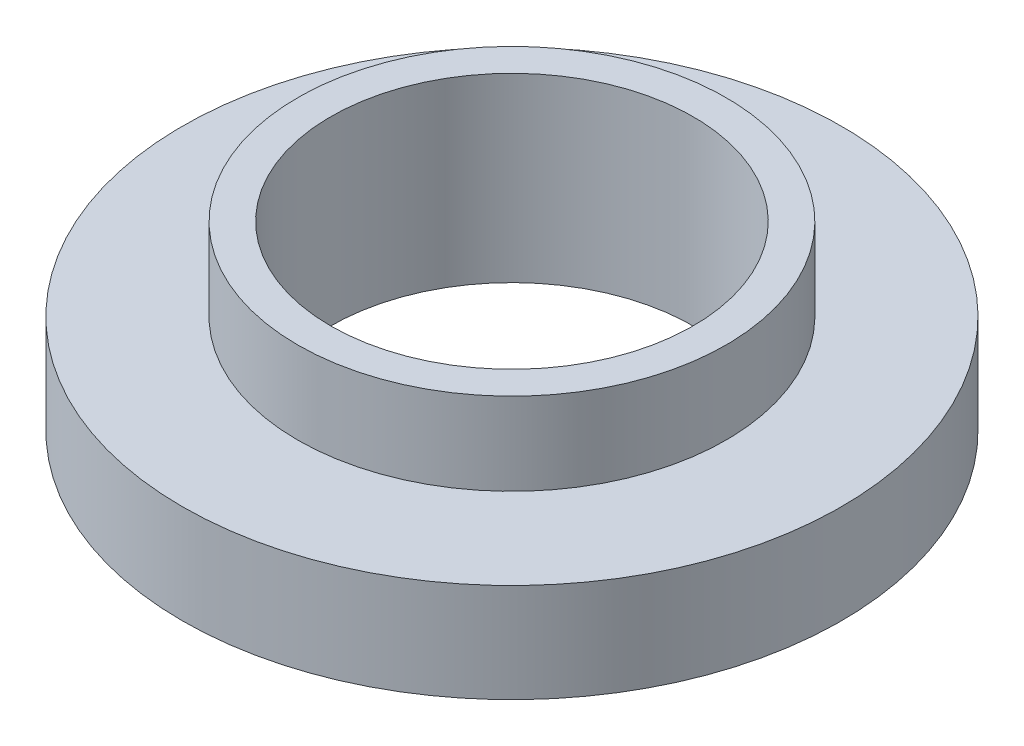
ISO-10303-21;
HEADER;
FILE_DESCRIPTION(('STEP AP214'),'2;1');
FILE_NAME('part.step','',(''),(''),'','','');
FILE_SCHEMA(('AUTOMOTIVE_DESIGN { 1 0 10303 214 1 1 1 1 }'));
ENDSEC;
DATA;
#1=APPLICATION_CONTEXT('core data for automotive mechanical design processes');
#2=APPLICATION_PROTOCOL_DEFINITION('international standard','automotive_design',2000,#1);
#3=PRODUCT_CONTEXT('',#1,'mechanical');
#4=PRODUCT('Part','Part','',(#3));
#5=PRODUCT_RELATED_PRODUCT_CATEGORY('part','',(#4));
#6=PRODUCT_DEFINITION_FORMATION('','',#4);
#7=PRODUCT_DEFINITION_CONTEXT('part definition',#1,'design');
#8=PRODUCT_DEFINITION('design','',#6,#7);
#9=PRODUCT_DEFINITION_SHAPE('','',#8);
#10=(LENGTH_UNIT() NAMED_UNIT(*) SI_UNIT(.MILLI.,.METRE.));
#11=(NAMED_UNIT(*) PLANE_ANGLE_UNIT() SI_UNIT($,.RADIAN.));
#12=(NAMED_UNIT(*) SI_UNIT($,.STERADIAN.) SOLID_ANGLE_UNIT());
#13=UNCERTAINTY_MEASURE_WITH_UNIT(LENGTH_MEASURE(1.E-05),#10,'distance_accuracy_value','');
#14=(GEOMETRIC_REPRESENTATION_CONTEXT(3) GLOBAL_UNCERTAINTY_ASSIGNED_CONTEXT((#13)) GLOBAL_UNIT_ASSIGNED_CONTEXT((#10,
#11,#12)) REPRESENTATION_CONTEXT('',''));
#15=CARTESIAN_POINT('',(0.,0.,0.));
#16=DIRECTION('',(0.,0.,1.));
#17=DIRECTION('',(1.,0.,0.));
#18=AXIS2_PLACEMENT_3D('',#15,#16,#17);
#19=CARTESIAN_POINT('',(0.,6.,0.));
#20=DIRECTION('',(0.,1.,0.));
#21=DIRECTION('',(0.,0.,1.));
#22=AXIS2_PLACEMENT_3D('',#19,#20,#21);
#23=PLANE('',#22);
#24=CARTESIAN_POINT('',(0.,6.,0.));
#25=DIRECTION('',(0.,1.,0.));
#26=DIRECTION('',(0.,0.,1.));
#27=AXIS2_PLACEMENT_3D('',#24,#25,#26);
#28=CIRCLE('',#27,20.);
#29=CARTESIAN_POINT('',(0.,6.,20.));
#30=VERTEX_POINT('',#29);
#31=EDGE_CURVE('E11',#30,#30,#28,.T.);
#32=ORIENTED_EDGE('',*,*,#31,.T.);
#33=EDGE_LOOP('',(#32));
#34=FACE_BOUND('',#33,.T.);
#35=CARTESIAN_POINT('',(0.,6.,0.));
#36=DIRECTION('',(0.,1.,0.));
#37=DIRECTION('',(0.,0.,1.));
#38=AXIS2_PLACEMENT_3D('',#35,#36,#37);
#39=CIRCLE('',#38,13.);
#40=CARTESIAN_POINT('',(0.,6.,13.));
#41=VERTEX_POINT('',#40);
#42=EDGE_CURVE('E96',#41,#41,#39,.T.);
#43=ORIENTED_EDGE('',*,*,#42,.F.);
#44=EDGE_LOOP('',(#43));
#45=FACE_BOUND('',#44,.T.);
#46=ADVANCED_FACE('F39',(#34,#45),#23,.T.);
#47=CARTESIAN_POINT('',(0.,0.,0.));
#48=DIRECTION('',(0.,1.,0.));
#49=DIRECTION('',(0.,0.,1.));
#50=AXIS2_PLACEMENT_3D('',#47,#48,#49);
#51=PLANE('',#50);
#52=CARTESIAN_POINT('',(14.,0.,0.));
#53=DIRECTION('',(0.,-1.,0.));
#54=DIRECTION('',(0.,0.,-1.));
#55=AXIS2_PLACEMENT_3D('',#52,#53,#54);
#56=CIRCLE('',#55,1.24999999999999);
#57=CARTESIAN_POINT('',(14.,0.,-1.24999999999999));
#58=VERTEX_POINT('',#57);
#59=EDGE_CURVE('E71',#58,#58,#56,.T.);
#60=ORIENTED_EDGE('',*,*,#59,.F.);
#61=EDGE_LOOP('',(#60));
#62=FACE_BOUND('',#61,.T.);
#63=CARTESIAN_POINT('',(0.,0.,14.));
#64=DIRECTION('',(0.,-1.,0.));
#65=DIRECTION('',(0.,0.,-1.));
#66=AXIS2_PLACEMENT_3D('',#63,#64,#65);
#67=CIRCLE('',#66,1.24999999999999);
#68=CARTESIAN_POINT('',(0.,0.,12.75));
#69=VERTEX_POINT('',#68);
#70=EDGE_CURVE('E70',#69,#69,#67,.T.);
#71=ORIENTED_EDGE('',*,*,#70,.F.);
#72=EDGE_LOOP('',(#71));
#73=FACE_BOUND('',#72,.T.);
#74=CARTESIAN_POINT('',(-14.,0.,0.));
#75=DIRECTION('',(0.,-1.,0.));
#76=DIRECTION('',(0.,0.,-1.));
#77=AXIS2_PLACEMENT_3D('',#74,#75,#76);
#78=CIRCLE('',#77,1.24999999999999);
#79=CARTESIAN_POINT('',(-14.,0.,-1.24999999999999));
#80=VERTEX_POINT('',#79);
#81=EDGE_CURVE('E81',#80,#80,#78,.T.);
#82=ORIENTED_EDGE('',*,*,#81,.F.);
#83=EDGE_LOOP('',(#82));
#84=FACE_BOUND('',#83,.T.);
#85=CARTESIAN_POINT('',(0.,0.,-14.));
#86=DIRECTION('',(0.,-1.,0.));
#87=DIRECTION('',(0.,0.,-1.));
#88=AXIS2_PLACEMENT_3D('',#85,#86,#87);
#89=CIRCLE('',#88,1.24999999999999);
#90=CARTESIAN_POINT('',(0.,0.,-15.25));
#91=VERTEX_POINT('',#90);
#92=EDGE_CURVE('E87',#91,#91,#89,.T.);
#93=ORIENTED_EDGE('',*,*,#92,.F.);
#94=EDGE_LOOP('',(#93));
#95=FACE_BOUND('',#94,.T.);
#96=CARTESIAN_POINT('',(0.,0.,0.));
#97=DIRECTION('',(0.,1.,0.));
#98=DIRECTION('',(0.,0.,1.));
#99=AXIS2_PLACEMENT_3D('',#96,#97,#98);
#100=CIRCLE('',#99,20.);
#101=CARTESIAN_POINT('',(0.,0.,20.));
#102=VERTEX_POINT('',#101);
#103=EDGE_CURVE('E43',#102,#102,#100,.T.);
#104=ORIENTED_EDGE('',*,*,#103,.F.);
#105=EDGE_LOOP('',(#104));
#106=FACE_BOUND('',#105,.T.);
#107=CARTESIAN_POINT('',(0.,0.,0.));
#108=DIRECTION('',(0.,1.,0.));
#109=DIRECTION('',(0.,0.,1.));
#110=AXIS2_PLACEMENT_3D('',#107,#108,#109);
#111=CIRCLE('',#110,11.);
#112=CARTESIAN_POINT('',(0.,0.,11.));
#113=VERTEX_POINT('',#112);
#114=EDGE_CURVE('E100',#113,#113,#111,.T.);
#115=ORIENTED_EDGE('',*,*,#114,.T.);
#116=EDGE_LOOP('',(#115));
#117=FACE_BOUND('',#116,.T.);
#118=ADVANCED_FACE('F110',(#62,#73,#84,#95,#106,#117),#51,.F.);
#119=CARTESIAN_POINT('',(0.,6.,0.));
#120=DIRECTION('',(0.,-1.,0.));
#121=DIRECTION('',(0.,0.,-1.));
#122=AXIS2_PLACEMENT_3D('',#119,#120,#121);
#123=CYLINDRICAL_SURFACE('',#122,20.);
#124=ORIENTED_EDGE('',*,*,#31,.F.);
#125=EDGE_LOOP('',(#124));
#126=FACE_BOUND('',#125,.T.);
#127=ORIENTED_EDGE('',*,*,#103,.T.);
#128=EDGE_LOOP('',(#127));
#129=FACE_BOUND('',#128,.T.);
#130=ADVANCED_FACE('F41',(#126,#129),#123,.T.);
#131=CARTESIAN_POINT('',(0.,6.,0.));
#132=DIRECTION('',(0.,-1.,0.));
#133=DIRECTION('',(0.,0.,-1.));
#134=AXIS2_PLACEMENT_3D('',#131,#132,#133);
#135=CYLINDRICAL_SURFACE('',#134,11.);
#136=ORIENTED_EDGE('',*,*,#114,.F.);
#137=EDGE_LOOP('',(#136));
#138=FACE_BOUND('',#137,.T.);
#139=CARTESIAN_POINT('',(0.,11.,0.));
#140=DIRECTION('',(0.,1.,0.));
#141=DIRECTION('',(0.,0.,1.));
#142=AXIS2_PLACEMENT_3D('',#139,#140,#141);
#143=CIRCLE('',#142,11.);
#144=CARTESIAN_POINT('',(0.,11.,11.));
#145=VERTEX_POINT('',#144);
#146=EDGE_CURVE('E93',#145,#145,#143,.T.);
#147=ORIENTED_EDGE('',*,*,#146,.T.);
#148=EDGE_LOOP('',(#147));
#149=FACE_BOUND('',#148,.T.);
#150=ADVANCED_FACE('F117',(#138,#149),#135,.F.);
#151=CARTESIAN_POINT('',(0.,11.,0.));
#152=DIRECTION('',(0.,1.,0.));
#153=DIRECTION('',(0.,0.,1.));
#154=AXIS2_PLACEMENT_3D('',#151,#152,#153);
#155=PLANE('',#154);
#156=CARTESIAN_POINT('',(0.,11.,0.));
#157=DIRECTION('',(0.,1.,0.));
#158=DIRECTION('',(0.,0.,1.));
#159=AXIS2_PLACEMENT_3D('',#156,#157,#158);
#160=CIRCLE('',#159,13.);
#161=CARTESIAN_POINT('',(0.,11.,13.));
#162=VERTEX_POINT('',#161);
#163=EDGE_CURVE('E97',#162,#162,#160,.T.);
#164=ORIENTED_EDGE('',*,*,#163,.T.);
#165=EDGE_LOOP('',(#164));
#166=FACE_BOUND('',#165,.T.);
#167=ORIENTED_EDGE('',*,*,#146,.F.);
#168=EDGE_LOOP('',(#167));
#169=FACE_BOUND('',#168,.T.);
#170=ADVANCED_FACE('F126',(#166,#169),#155,.T.);
#171=CARTESIAN_POINT('',(0.,11.,0.));
#172=DIRECTION('',(0.,-1.,0.));
#173=DIRECTION('',(0.,0.,-1.));
#174=AXIS2_PLACEMENT_3D('',#171,#172,#173);
#175=CYLINDRICAL_SURFACE('',#174,13.);
#176=ORIENTED_EDGE('',*,*,#163,.F.);
#177=EDGE_LOOP('',(#176));
#178=FACE_BOUND('',#177,.T.);
#179=ORIENTED_EDGE('',*,*,#42,.T.);
#180=EDGE_LOOP('',(#179));
#181=FACE_BOUND('',#180,.T.);
#182=ADVANCED_FACE('F128',(#178,#181),#175,.T.);
#183=CARTESIAN_POINT('',(0.,5.,-14.));
#184=DIRECTION('',(0.,-1.,0.));
#185=DIRECTION('',(0.,0.,-1.));
#186=AXIS2_PLACEMENT_3D('',#183,#184,#185);
#187=CONICAL_SURFACE('',#186,1.25,1.02974425867665);
#188=CARTESIAN_POINT('',(0.,5.75107577378445,-14.));
#189=VERTEX_POINT('',#188);
#190=VERTEX_LOOP('',#189);
#191=FACE_BOUND('',#190,.T.);
#192=CARTESIAN_POINT('',(0.,5.,-14.));
#193=DIRECTION('',(0.,-1.,0.));
#194=DIRECTION('',(0.,0.,-1.));
#195=AXIS2_PLACEMENT_3D('',#192,#193,#194);
#196=CIRCLE('',#195,1.25);
#197=CARTESIAN_POINT('',(0.,5.,-15.25));
#198=VERTEX_POINT('',#197);
#199=EDGE_CURVE('E90',#198,#198,#196,.T.);
#200=ORIENTED_EDGE('',*,*,#199,.T.);
#201=EDGE_LOOP('',(#200));
#202=FACE_BOUND('',#201,.T.);
#203=ADVANCED_FACE('F131',(#191,#202),#187,.F.);
#204=CARTESIAN_POINT('',(0.,0.,-14.));
#205=DIRECTION('',(0.,-1.,0.));
#206=DIRECTION('',(0.,0.,-1.));
#207=AXIS2_PLACEMENT_3D('',#204,#205,#206);
#208=CYLINDRICAL_SURFACE('',#207,1.24999999999999);
#209=ORIENTED_EDGE('',*,*,#199,.F.);
#210=EDGE_LOOP('',(#209));
#211=FACE_BOUND('',#210,.T.);
#212=ORIENTED_EDGE('',*,*,#92,.T.);
#213=EDGE_LOOP('',(#212));
#214=FACE_BOUND('',#213,.T.);
#215=ADVANCED_FACE('F138',(#211,#214),#208,.F.);
#216=CARTESIAN_POINT('',(-14.,5.,0.));
#217=DIRECTION('',(0.,-1.,0.));
#218=DIRECTION('',(0.,0.,-1.));
#219=AXIS2_PLACEMENT_3D('',#216,#217,#218);
#220=CONICAL_SURFACE('',#219,1.25,1.02974425867665);
#221=CARTESIAN_POINT('',(-14.,5.75107577378445,0.));
#222=VERTEX_POINT('',#221);
#223=VERTEX_LOOP('',#222);
#224=FACE_BOUND('',#223,.T.);
#225=CARTESIAN_POINT('',(-14.,5.,0.));
#226=DIRECTION('',(0.,-1.,0.));
#227=DIRECTION('',(0.,0.,-1.));
#228=AXIS2_PLACEMENT_3D('',#225,#226,#227);
#229=CIRCLE('',#228,1.25);
#230=CARTESIAN_POINT('',(-14.,5.,-1.25));
#231=VERTEX_POINT('',#230);
#232=EDGE_CURVE('E84',#231,#231,#229,.T.);
#233=ORIENTED_EDGE('',*,*,#232,.T.);
#234=EDGE_LOOP('',(#233));
#235=FACE_BOUND('',#234,.T.);
#236=ADVANCED_FACE('F141',(#224,#235),#220,.F.);
#237=CARTESIAN_POINT('',(-14.,0.,0.));
#238=DIRECTION('',(0.,-1.,0.));
#239=DIRECTION('',(0.,0.,-1.));
#240=AXIS2_PLACEMENT_3D('',#237,#238,#239);
#241=CYLINDRICAL_SURFACE('',#240,1.24999999999999);
#242=ORIENTED_EDGE('',*,*,#232,.F.);
#243=EDGE_LOOP('',(#242));
#244=FACE_BOUND('',#243,.T.);
#245=ORIENTED_EDGE('',*,*,#81,.T.);
#246=EDGE_LOOP('',(#245));
#247=FACE_BOUND('',#246,.T.);
#248=ADVANCED_FACE('F145',(#244,#247),#241,.F.);
#249=CARTESIAN_POINT('',(0.,5.,14.));
#250=DIRECTION('',(0.,-1.,0.));
#251=DIRECTION('',(0.,0.,-1.));
#252=AXIS2_PLACEMENT_3D('',#249,#250,#251);
#253=CONICAL_SURFACE('',#252,1.25,1.02974425867665);
#254=CARTESIAN_POINT('',(0.,5.75107577378445,14.));
#255=VERTEX_POINT('',#254);
#256=VERTEX_LOOP('',#255);
#257=FACE_BOUND('',#256,.T.);
#258=CARTESIAN_POINT('',(0.,5.,14.));
#259=DIRECTION('',(0.,-1.,0.));
#260=DIRECTION('',(0.,0.,-1.));
#261=AXIS2_PLACEMENT_3D('',#258,#259,#260);
#262=CIRCLE('',#261,1.25);
#263=CARTESIAN_POINT('',(0.,5.,12.75));
#264=VERTEX_POINT('',#263);
#265=EDGE_CURVE('E74',#264,#264,#262,.T.);
#266=ORIENTED_EDGE('',*,*,#265,.T.);
#267=EDGE_LOOP('',(#266));
#268=FACE_BOUND('',#267,.T.);
#269=ADVANCED_FACE('F148',(#257,#268),#253,.F.);
#270=CARTESIAN_POINT('',(0.,0.,14.));
#271=DIRECTION('',(0.,-1.,0.));
#272=DIRECTION('',(0.,0.,-1.));
#273=AXIS2_PLACEMENT_3D('',#270,#271,#272);
#274=CYLINDRICAL_SURFACE('',#273,1.24999999999999);
#275=ORIENTED_EDGE('',*,*,#265,.F.);
#276=EDGE_LOOP('',(#275));
#277=FACE_BOUND('',#276,.T.);
#278=ORIENTED_EDGE('',*,*,#70,.T.);
#279=EDGE_LOOP('',(#278));
#280=FACE_BOUND('',#279,.T.);
#281=ADVANCED_FACE('F64',(#277,#280),#274,.F.);
#282=CARTESIAN_POINT('',(14.,5.,0.));
#283=DIRECTION('',(0.,-1.,0.));
#284=DIRECTION('',(0.,0.,-1.));
#285=AXIS2_PLACEMENT_3D('',#282,#283,#284);
#286=CONICAL_SURFACE('',#285,1.25,1.02974425867665);
#287=CARTESIAN_POINT('',(14.,5.75107577378445,0.));
#288=VERTEX_POINT('',#287);
#289=VERTEX_LOOP('',#288);
#290=FACE_BOUND('',#289,.T.);
#291=CARTESIAN_POINT('',(14.,5.,0.));
#292=DIRECTION('',(0.,-1.,0.));
#293=DIRECTION('',(0.,0.,-1.));
#294=AXIS2_PLACEMENT_3D('',#291,#292,#293);
#295=CIRCLE('',#294,1.25);
#296=CARTESIAN_POINT('',(14.,5.,-1.25));
#297=VERTEX_POINT('',#296);
#298=EDGE_CURVE('E68',#297,#297,#295,.T.);
#299=ORIENTED_EDGE('',*,*,#298,.T.);
#300=EDGE_LOOP('',(#299));
#301=FACE_BOUND('',#300,.T.);
#302=ADVANCED_FACE('F60',(#290,#301),#286,.F.);
#303=CARTESIAN_POINT('',(14.,0.,0.));
#304=DIRECTION('',(0.,-1.,0.));
#305=DIRECTION('',(0.,0.,-1.));
#306=AXIS2_PLACEMENT_3D('',#303,#304,#305);
#307=CYLINDRICAL_SURFACE('',#306,1.24999999999999);
#308=ORIENTED_EDGE('',*,*,#298,.F.);
#309=EDGE_LOOP('',(#308));
#310=FACE_BOUND('',#309,.T.);
#311=ORIENTED_EDGE('',*,*,#59,.T.);
#312=EDGE_LOOP('',(#311));
#313=FACE_BOUND('',#312,.T.);
#314=ADVANCED_FACE('F63',(#310,#313),#307,.F.);
#315=CLOSED_SHELL('',(#46,#118,#130,#150,#170,#182,#203,#215,#236,#248,#269,#281,#302,#314));
#316=MANIFOLD_SOLID_BREP('B2',#315);
#317=ADVANCED_BREP_SHAPE_REPRESENTATION('',(#18,#316),#14);
#318=SHAPE_DEFINITION_REPRESENTATION(#9,#317);
ENDSEC;
END-ISO-10303-21;
